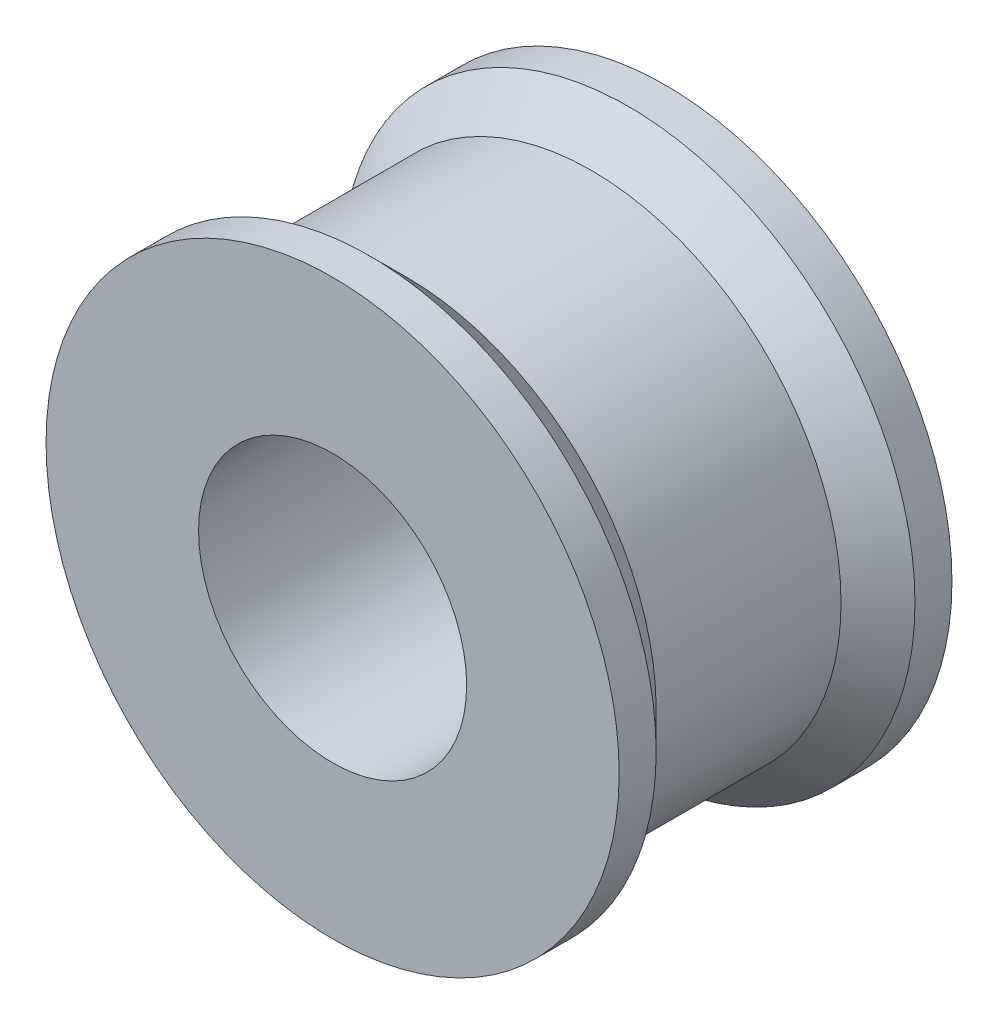
ISO-10303-21;
HEADER;
FILE_DESCRIPTION(('STEP AP214'),'2;1');
FILE_NAME('part.step','',(''),(''),'','','');
FILE_SCHEMA(('AUTOMOTIVE_DESIGN { 1 0 10303 214 1 1 1 1 }'));
ENDSEC;
DATA;
#1=APPLICATION_CONTEXT('core data for automotive mechanical design processes');
#2=APPLICATION_PROTOCOL_DEFINITION('international standard','automotive_design',2000,#1);
#3=PRODUCT_CONTEXT('',#1,'mechanical');
#4=PRODUCT('Part','Part','',(#3));
#5=PRODUCT_RELATED_PRODUCT_CATEGORY('part','',(#4));
#6=PRODUCT_DEFINITION_FORMATION('','',#4);
#7=PRODUCT_DEFINITION_CONTEXT('part definition',#1,'design');
#8=PRODUCT_DEFINITION('design','',#6,#7);
#9=PRODUCT_DEFINITION_SHAPE('','',#8);
#10=(LENGTH_UNIT() NAMED_UNIT(*) SI_UNIT(.MILLI.,.METRE.));
#11=(NAMED_UNIT(*) PLANE_ANGLE_UNIT() SI_UNIT($,.RADIAN.));
#12=(NAMED_UNIT(*) SI_UNIT($,.STERADIAN.) SOLID_ANGLE_UNIT());
#13=UNCERTAINTY_MEASURE_WITH_UNIT(LENGTH_MEASURE(1.E-05),#10,'distance_accuracy_value','');
#14=(GEOMETRIC_REPRESENTATION_CONTEXT(3) GLOBAL_UNCERTAINTY_ASSIGNED_CONTEXT((#13)) GLOBAL_UNIT_ASSIGNED_CONTEXT((#10,
#11,#12)) REPRESENTATION_CONTEXT('',''));
#15=CARTESIAN_POINT('',(0.,0.,0.));
#16=DIRECTION('',(0.,0.,1.));
#17=DIRECTION('',(1.,0.,0.));
#18=AXIS2_PLACEMENT_3D('',#15,#16,#17);
#19=CARTESIAN_POINT('',(0.,0.,0.));
#20=DIRECTION('',(0.,0.,1.));
#21=DIRECTION('',(1.,0.,0.));
#22=AXIS2_PLACEMENT_3D('',#19,#20,#21);
#23=PLANE('',#22);
#24=CARTESIAN_POINT('',(0.,0.,0.));
#25=DIRECTION('',(0.,0.,1.));
#26=DIRECTION('',(1.,0.,0.));
#27=AXIS2_PLACEMENT_3D('',#24,#25,#26);
#28=CIRCLE('',#27,7.75);
#29=CARTESIAN_POINT('',(7.75,0.,0.));
#30=VERTEX_POINT('',#29);
#31=EDGE_CURVE('E42',#30,#30,#28,.T.);
#32=ORIENTED_EDGE('',*,*,#31,.F.);
#33=EDGE_LOOP('',(#32));
#34=FACE_BOUND('',#33,.T.);
#35=CARTESIAN_POINT('',(0.,0.,0.));
#36=DIRECTION('',(0.,0.,1.));
#37=DIRECTION('',(1.,0.,0.));
#38=AXIS2_PLACEMENT_3D('',#35,#36,#37);
#39=CIRCLE('',#38,3.625);
#40=CARTESIAN_POINT('',(3.625,0.,0.));
#41=VERTEX_POINT('',#40);
#42=EDGE_CURVE('E47',#41,#41,#39,.T.);
#43=ORIENTED_EDGE('',*,*,#42,.T.);
#44=EDGE_LOOP('',(#43));
#45=FACE_BOUND('',#44,.T.);
#46=ADVANCED_FACE('F31',(#34,#45),#23,.F.);
#47=CARTESIAN_POINT('',(0.,0.,1.));
#48=DIRECTION('',(0.,0.,-1.));
#49=DIRECTION('',(-1.,0.,0.));
#50=AXIS2_PLACEMENT_3D('',#47,#48,#49);
#51=CYLINDRICAL_SURFACE('',#50,7.75);
#52=CARTESIAN_POINT('',(0.,0.,1.));
#53=DIRECTION('',(0.,0.,1.));
#54=DIRECTION('',(1.,0.,0.));
#55=AXIS2_PLACEMENT_3D('',#52,#53,#54);
#56=CIRCLE('',#55,7.75);
#57=CARTESIAN_POINT('',(7.75,0.,1.));
#58=VERTEX_POINT('',#57);
#59=EDGE_CURVE('E38',#58,#58,#56,.T.);
#60=ORIENTED_EDGE('',*,*,#59,.F.);
#61=EDGE_LOOP('',(#60));
#62=FACE_BOUND('',#61,.T.);
#63=ORIENTED_EDGE('',*,*,#31,.T.);
#64=EDGE_LOOP('',(#63));
#65=FACE_BOUND('',#64,.T.);
#66=ADVANCED_FACE('F80',(#62,#65),#51,.T.);
#67=CARTESIAN_POINT('',(0.,0.,1.));
#68=DIRECTION('',(0.,0.,-1.));
#69=DIRECTION('',(-1.,0.,0.));
#70=AXIS2_PLACEMENT_3D('',#67,#68,#69);
#71=CYLINDRICAL_SURFACE('',#70,3.625);
#72=ORIENTED_EDGE('',*,*,#42,.F.);
#73=EDGE_LOOP('',(#72));
#74=FACE_BOUND('',#73,.T.);
#75=CARTESIAN_POINT('',(0.,0.,9.));
#76=DIRECTION('',(0.,0.,1.));
#77=DIRECTION('',(1.,0.,0.));
#78=AXIS2_PLACEMENT_3D('',#75,#76,#77);
#79=CIRCLE('',#78,3.625);
#80=CARTESIAN_POINT('',(3.625,0.,9.));
#81=VERTEX_POINT('',#80);
#82=EDGE_CURVE('E58',#81,#81,#79,.T.);
#83=ORIENTED_EDGE('',*,*,#82,.T.);
#84=EDGE_LOOP('',(#83));
#85=FACE_BOUND('',#84,.T.);
#86=ADVANCED_FACE('F64',(#74,#85),#71,.F.);
#87=CARTESIAN_POINT('',(0.,0.,4.5));
#88=DIRECTION('',(0.,0.,-1.));
#89=DIRECTION('',(-1.,0.,0.));
#90=AXIS2_PLACEMENT_3D('',#87,#88,#89);
#91=CYLINDRICAL_SURFACE('',#90,6.75);
#92=CARTESIAN_POINT('',(0.,0.,2.00000000000001));
#93=DIRECTION('',(0.,0.,1.));
#94=DIRECTION('',(1.,0.,0.));
#95=AXIS2_PLACEMENT_3D('',#92,#93,#94);
#96=CIRCLE('',#95,6.75);
#97=CARTESIAN_POINT('',(6.75,0.,2.00000000000001));
#98=VERTEX_POINT('',#97);
#99=EDGE_CURVE('E10',#98,#98,#96,.T.);
#100=ORIENTED_EDGE('',*,*,#99,.T.);
#101=EDGE_LOOP('',(#100));
#102=FACE_BOUND('',#101,.T.);
#103=CARTESIAN_POINT('',(0.,0.,6.99999999999999));
#104=DIRECTION('',(0.,0.,1.));
#105=DIRECTION('',(1.,0.,0.));
#106=AXIS2_PLACEMENT_3D('',#103,#104,#105);
#107=CIRCLE('',#106,6.75);
#108=CARTESIAN_POINT('',(6.75,0.,6.99999999999999));
#109=VERTEX_POINT('',#108);
#110=EDGE_CURVE('E51',#109,#109,#107,.T.);
#111=ORIENTED_EDGE('',*,*,#110,.F.);
#112=EDGE_LOOP('',(#111));
#113=FACE_BOUND('',#112,.T.);
#114=ADVANCED_FACE('F78',(#102,#113),#91,.T.);
#115=CARTESIAN_POINT('',(0.,0.,2.00000000000001));
#116=DIRECTION('',(0.,0.,-1.));
#117=DIRECTION('',(-1.,0.,0.));
#118=AXIS2_PLACEMENT_3D('',#115,#116,#117);
#119=CONICAL_SURFACE('',#118,6.75,0.785398163397443);
#120=ORIENTED_EDGE('',*,*,#59,.T.);
#121=EDGE_LOOP('',(#120));
#122=FACE_BOUND('',#121,.T.);
#123=ORIENTED_EDGE('',*,*,#99,.F.);
#124=EDGE_LOOP('',(#123));
#125=FACE_BOUND('',#124,.T.);
#126=ADVANCED_FACE('F33',(#122,#125),#119,.T.);
#127=CARTESIAN_POINT('',(0.,0.,9.));
#128=DIRECTION('',(0.,0.,-1.));
#129=DIRECTION('',(1.,0.,0.));
#130=AXIS2_PLACEMENT_3D('',#127,#128,#129);
#131=PLANE('',#130);
#132=CARTESIAN_POINT('',(0.,0.,9.));
#133=DIRECTION('',(0.,0.,1.));
#134=DIRECTION('',(1.,0.,0.));
#135=AXIS2_PLACEMENT_3D('',#132,#133,#134);
#136=CIRCLE('',#135,7.75);
#137=CARTESIAN_POINT('',(7.75,0.,9.));
#138=VERTEX_POINT('',#137);
#139=EDGE_CURVE('E55',#138,#138,#136,.T.);
#140=ORIENTED_EDGE('',*,*,#139,.T.);
#141=EDGE_LOOP('',(#140));
#142=FACE_BOUND('',#141,.T.);
#143=ORIENTED_EDGE('',*,*,#82,.F.);
#144=EDGE_LOOP('',(#143));
#145=FACE_BOUND('',#144,.T.);
#146=ADVANCED_FACE('F66',(#142,#145),#131,.F.);
#147=CARTESIAN_POINT('',(0.,0.,8.));
#148=DIRECTION('',(0.,0.,1.));
#149=DIRECTION('',(-1.,0.,0.));
#150=AXIS2_PLACEMENT_3D('',#147,#148,#149);
#151=CYLINDRICAL_SURFACE('',#150,7.75);
#152=CARTESIAN_POINT('',(0.,0.,8.));
#153=DIRECTION('',(0.,0.,1.));
#154=DIRECTION('',(1.,0.,0.));
#155=AXIS2_PLACEMENT_3D('',#152,#153,#154);
#156=CIRCLE('',#155,7.75);
#157=CARTESIAN_POINT('',(7.75,0.,8.));
#158=VERTEX_POINT('',#157);
#159=EDGE_CURVE('E54',#158,#158,#156,.T.);
#160=ORIENTED_EDGE('',*,*,#159,.T.);
#161=EDGE_LOOP('',(#160));
#162=FACE_BOUND('',#161,.T.);
#163=ORIENTED_EDGE('',*,*,#139,.F.);
#164=EDGE_LOOP('',(#163));
#165=FACE_BOUND('',#164,.T.);
#166=ADVANCED_FACE('F68',(#162,#165),#151,.T.);
#167=CARTESIAN_POINT('',(0.,0.,6.99999999999999));
#168=DIRECTION('',(0.,0.,1.));
#169=DIRECTION('',(-1.,0.,0.));
#170=AXIS2_PLACEMENT_3D('',#167,#168,#169);
#171=CONICAL_SURFACE('',#170,6.75,0.785398163397443);
#172=ORIENTED_EDGE('',*,*,#159,.F.);
#173=EDGE_LOOP('',(#172));
#174=FACE_BOUND('',#173,.T.);
#175=ORIENTED_EDGE('',*,*,#110,.T.);
#176=EDGE_LOOP('',(#175));
#177=FACE_BOUND('',#176,.T.);
#178=ADVANCED_FACE('F75',(#174,#177),#171,.T.);
#179=CLOSED_SHELL('',(#46,#66,#86,#114,#126,#146,#166,#178));
#180=MANIFOLD_SOLID_BREP('B2',#179);
#181=ADVANCED_BREP_SHAPE_REPRESENTATION('',(#18,#180),#14);
#182=SHAPE_DEFINITION_REPRESENTATION(#9,#181);
ENDSEC;
END-ISO-10303-21;
